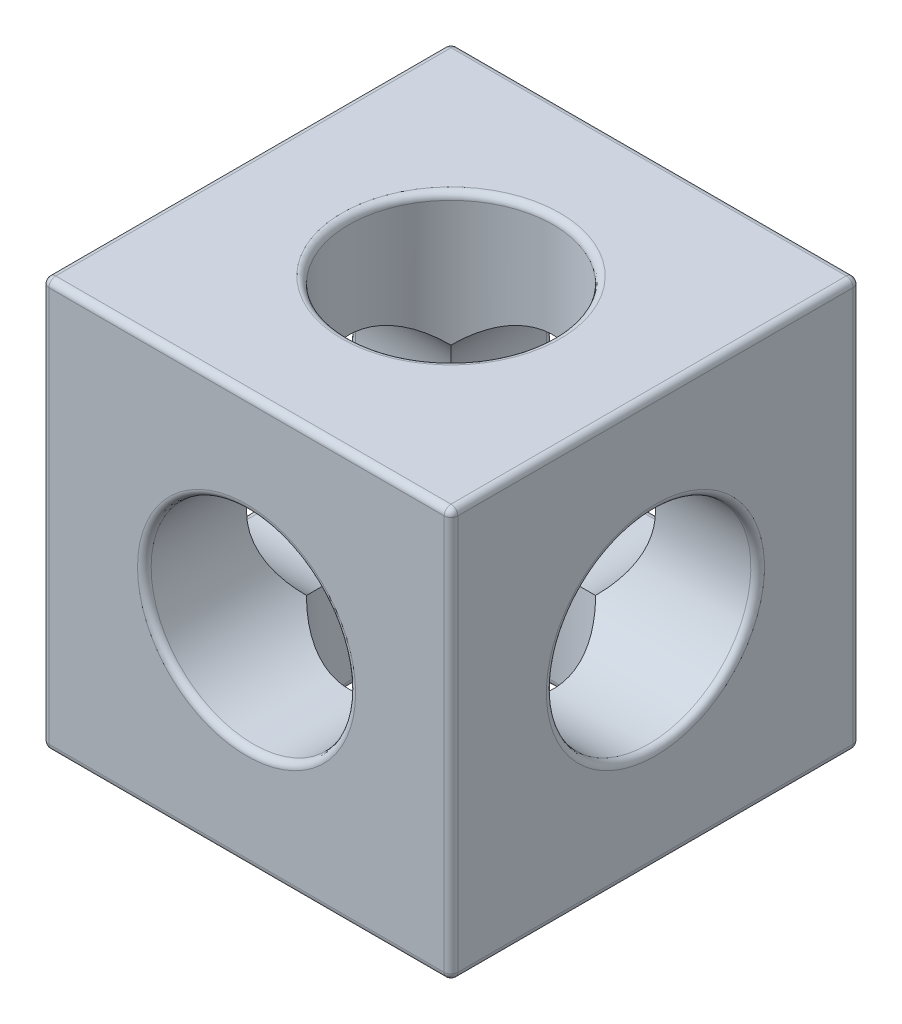
ISO-10303-21;
HEADER;
FILE_DESCRIPTION(('STEP AP214'),'2;1');
FILE_NAME('part.step','',(''),(''),'','','');
FILE_SCHEMA(('AUTOMOTIVE_DESIGN { 1 0 10303 214 1 1 1 1 }'));
ENDSEC;
DATA;
#1=APPLICATION_CONTEXT('core data for automotive mechanical design processes');
#2=APPLICATION_PROTOCOL_DEFINITION('international standard','automotive_design',2000,#1);
#3=PRODUCT_CONTEXT('',#1,'mechanical');
#4=PRODUCT('Part','Part','',(#3));
#5=PRODUCT_RELATED_PRODUCT_CATEGORY('part','',(#4));
#6=PRODUCT_DEFINITION_FORMATION('','',#4);
#7=PRODUCT_DEFINITION_CONTEXT('part definition',#1,'design');
#8=PRODUCT_DEFINITION('design','',#6,#7);
#9=PRODUCT_DEFINITION_SHAPE('','',#8);
#10=(LENGTH_UNIT() NAMED_UNIT(*) SI_UNIT(.MILLI.,.METRE.));
#11=(NAMED_UNIT(*) PLANE_ANGLE_UNIT() SI_UNIT($,.RADIAN.));
#12=(NAMED_UNIT(*) SI_UNIT($,.STERADIAN.) SOLID_ANGLE_UNIT());
#13=UNCERTAINTY_MEASURE_WITH_UNIT(LENGTH_MEASURE(1.E-05),#10,'distance_accuracy_value','');
#14=(GEOMETRIC_REPRESENTATION_CONTEXT(3) GLOBAL_UNCERTAINTY_ASSIGNED_CONTEXT((#13)) GLOBAL_UNIT_ASSIGNED_CONTEXT((#10,
#11,#12)) REPRESENTATION_CONTEXT('',''));
#15=CARTESIAN_POINT('',(0.,0.,0.));
#16=DIRECTION('',(0.,0.,1.));
#17=DIRECTION('',(1.,0.,0.));
#18=AXIS2_PLACEMENT_3D('',#15,#16,#17);
#19=CARTESIAN_POINT('',(38.1,0.,38.1));
#20=DIRECTION('',(0.,1.,0.));
#21=DIRECTION('',(0.,0.,1.));
#22=AXIS2_PLACEMENT_3D('',#19,#20,#21);
#23=CYLINDRICAL_SURFACE('',#22,19.05);
#24=CARTESIAN_POINT('',(38.1,74.93,38.1));
#25=DIRECTION('',(0.,-1.,0.));
#26=DIRECTION('',(0.,0.,-1.));
#27=AXIS2_PLACEMENT_3D('',#24,#25,#26);
#28=CIRCLE('',#27,19.05);
#29=CARTESIAN_POINT('',(38.1,74.93,19.05));
#30=VERTEX_POINT('',#29);
#31=EDGE_CURVE('E11',#30,#30,#28,.F.);
#32=ORIENTED_EDGE('',*,*,#31,.T.);
#33=EDGE_LOOP('',(#32));
#34=FACE_BOUND('',#33,.T.);
#35=CARTESIAN_POINT('',(38.1,38.1,38.1));
#36=DIRECTION('',(-0.707106781186548,0.707106781186547,0.));
#37=DIRECTION('',(0.707106781186547,0.707106781186547,0.));
#38=AXIS2_PLACEMENT_3D('',#35,#36,#37);
#39=ELLIPSE('',#38,26.9407683632075,19.05);
#40=CARTESIAN_POINT('',(51.5703841816037,51.5703841816037,24.6296158183963));
#41=VERTEX_POINT('',#40);
#42=CARTESIAN_POINT('',(51.5703841816037,51.5703841816037,51.5703841816037));
#43=VERTEX_POINT('',#42);
#44=EDGE_CURVE('E167',#41,#43,#39,.F.);
#45=ORIENTED_EDGE('',*,*,#44,.T.);
#46=CARTESIAN_POINT('',(38.1,38.1,38.1));
#47=DIRECTION('',(0.,0.707106781186547,-0.707106781186547));
#48=DIRECTION('',(0.,0.707106781186547,0.707106781186547));
#49=AXIS2_PLACEMENT_3D('',#46,#47,#48);
#50=ELLIPSE('',#49,26.9407683632075,19.05);
#51=CARTESIAN_POINT('',(24.6296158183963,51.5703841816037,51.5703841816037));
#52=VERTEX_POINT('',#51);
#53=EDGE_CURVE('E151',#43,#52,#50,.F.);
#54=ORIENTED_EDGE('',*,*,#53,.T.);
#55=CARTESIAN_POINT('',(38.1,38.1,38.1));
#56=DIRECTION('',(0.707106781186547,0.707106781186547,0.));
#57=DIRECTION('',(-0.707106781186548,0.707106781186547,0.));
#58=AXIS2_PLACEMENT_3D('',#55,#56,#57);
#59=ELLIPSE('',#58,26.9407683632075,19.05);
#60=CARTESIAN_POINT('',(24.6296158183963,51.5703841816037,24.6296158183963));
#61=VERTEX_POINT('',#60);
#62=EDGE_CURVE('E160',#52,#61,#59,.F.);
#63=ORIENTED_EDGE('',*,*,#62,.T.);
#64=CARTESIAN_POINT('',(38.1,38.1,38.1));
#65=DIRECTION('',(0.,0.707106781186547,0.707106781186547));
#66=DIRECTION('',(0.,0.707106781186547,-0.707106781186547));
#67=AXIS2_PLACEMENT_3D('',#64,#65,#66);
#68=ELLIPSE('',#67,26.9407683632075,19.05);
#69=EDGE_CURVE('E342',#61,#41,#68,.F.);
#70=ORIENTED_EDGE('',*,*,#69,.T.);
#71=EDGE_LOOP('',(#45,#54,#63,#70));
#72=FACE_BOUND('',#71,.T.);
#73=ADVANCED_FACE('F35',(#34,#72),#23,.F.);
#74=CARTESIAN_POINT('',(0.,0.,76.2));
#75=DIRECTION('',(1.,0.,0.));
#76=DIRECTION('',(0.,1.,0.));
#77=AXIS2_PLACEMENT_3D('',#74,#75,#76);
#78=PLANE('',#77);
#79=CARTESIAN_POINT('',(0.,38.1,38.1));
#80=DIRECTION('',(1.,0.,0.));
#81=DIRECTION('',(0.,1.,0.));
#82=AXIS2_PLACEMENT_3D('',#79,#80,#81);
#83=CIRCLE('',#82,20.32);
#84=CARTESIAN_POINT('',(0.,58.42,38.1));
#85=VERTEX_POINT('',#84);
#86=EDGE_CURVE('E204',#85,#85,#83,.T.);
#87=ORIENTED_EDGE('',*,*,#86,.T.);
#88=EDGE_LOOP('',(#87));
#89=FACE_BOUND('',#88,.T.);
#90=DIRECTION('',(0.,0.,-1.));
#91=VECTOR('',#90,1.);
#92=CARTESIAN_POINT('',(0.,74.93,76.2));
#93=LINE('',#92,#91);
#94=CARTESIAN_POINT('',(0.,74.93,74.93));
#95=VERTEX_POINT('',#94);
#96=CARTESIAN_POINT('',(0.,74.93,1.26999999999999));
#97=VERTEX_POINT('',#96);
#98=EDGE_CURVE('E195',#95,#97,#93,.T.);
#99=ORIENTED_EDGE('',*,*,#98,.T.);
#100=DIRECTION('',(0.,-1.,0.));
#101=VECTOR('',#100,1.);
#102=CARTESIAN_POINT('',(0.,0.,1.26999999999999));
#103=LINE('',#102,#101);
#104=CARTESIAN_POINT('',(0.,1.27,1.26999999999999));
#105=VERTEX_POINT('',#104);
#106=EDGE_CURVE('E201',#97,#105,#103,.T.);
#107=ORIENTED_EDGE('',*,*,#106,.T.);
#108=DIRECTION('',(0.,0.,-1.));
#109=VECTOR('',#108,1.);
#110=CARTESIAN_POINT('',(0.,1.27,76.2));
#111=LINE('',#110,#109);
#112=CARTESIAN_POINT('',(0.,1.27,74.93));
#113=VERTEX_POINT('',#112);
#114=EDGE_CURVE('E199',#105,#113,#111,.F.);
#115=ORIENTED_EDGE('',*,*,#114,.T.);
#116=DIRECTION('',(0.,-1.,0.));
#117=VECTOR('',#116,1.);
#118=CARTESIAN_POINT('',(0.,0.,74.93));
#119=LINE('',#118,#117);
#120=EDGE_CURVE('E197',#113,#95,#119,.F.);
#121=ORIENTED_EDGE('',*,*,#120,.T.);
#122=EDGE_LOOP('',(#99,#107,#115,#121));
#123=FACE_BOUND('',#122,.T.);
#124=ADVANCED_FACE('F365',(#89,#123),#78,.F.);
#125=CARTESIAN_POINT('',(0.,0.,76.2));
#126=DIRECTION('',(0.,1.,0.));
#127=DIRECTION('',(0.,0.,1.));
#128=AXIS2_PLACEMENT_3D('',#125,#126,#127);
#129=PLANE('',#128);
#130=CARTESIAN_POINT('',(38.1,0.,38.1));
#131=DIRECTION('',(0.,1.,0.));
#132=DIRECTION('',(0.,0.,1.));
#133=AXIS2_PLACEMENT_3D('',#130,#131,#132);
#134=CIRCLE('',#133,20.32);
#135=CARTESIAN_POINT('',(38.1,0.,58.42));
#136=VERTEX_POINT('',#135);
#137=EDGE_CURVE('E219',#136,#136,#134,.T.);
#138=ORIENTED_EDGE('',*,*,#137,.T.);
#139=EDGE_LOOP('',(#138));
#140=FACE_BOUND('',#139,.T.);
#141=DIRECTION('',(1.,0.,0.));
#142=VECTOR('',#141,1.);
#143=CARTESIAN_POINT('',(0.,0.,74.93));
#144=LINE('',#143,#142);
#145=CARTESIAN_POINT('',(74.93,0.,74.93));
#146=VERTEX_POINT('',#145);
#147=CARTESIAN_POINT('',(1.27,0.,74.93));
#148=VERTEX_POINT('',#147);
#149=EDGE_CURVE('E210',#146,#148,#144,.F.);
#150=ORIENTED_EDGE('',*,*,#149,.T.);
#151=DIRECTION('',(0.,0.,-1.));
#152=VECTOR('',#151,1.);
#153=CARTESIAN_POINT('',(1.27,0.,76.2));
#154=LINE('',#153,#152);
#155=CARTESIAN_POINT('',(1.27,0.,1.26999999999999));
#156=VERTEX_POINT('',#155);
#157=EDGE_CURVE('E216',#148,#156,#154,.T.);
#158=ORIENTED_EDGE('',*,*,#157,.T.);
#159=DIRECTION('',(1.,0.,0.));
#160=VECTOR('',#159,1.);
#161=CARTESIAN_POINT('',(76.2,0.,1.26999999999999));
#162=LINE('',#161,#160);
#163=CARTESIAN_POINT('',(74.93,0.,1.26999999999999));
#164=VERTEX_POINT('',#163);
#165=EDGE_CURVE('E214',#156,#164,#162,.T.);
#166=ORIENTED_EDGE('',*,*,#165,.T.);
#167=DIRECTION('',(0.,0.,-1.));
#168=VECTOR('',#167,1.);
#169=CARTESIAN_POINT('',(74.93,0.,76.2));
#170=LINE('',#169,#168);
#171=EDGE_CURVE('E212',#164,#146,#170,.F.);
#172=ORIENTED_EDGE('',*,*,#171,.T.);
#173=EDGE_LOOP('',(#150,#158,#166,#172));
#174=FACE_BOUND('',#173,.T.);
#175=ADVANCED_FACE('F370',(#140,#174),#129,.F.);
#176=CARTESIAN_POINT('',(76.2,0.,76.2));
#177=DIRECTION('',(-1.,0.,0.));
#178=DIRECTION('',(0.,-1.,0.));
#179=AXIS2_PLACEMENT_3D('',#176,#177,#178);
#180=PLANE('',#179);
#181=CARTESIAN_POINT('',(76.2,38.1,38.1));
#182=DIRECTION('',(-1.,0.,0.));
#183=DIRECTION('',(0.,-1.,0.));
#184=AXIS2_PLACEMENT_3D('',#181,#182,#183);
#185=CIRCLE('',#184,20.32);
#186=CARTESIAN_POINT('',(76.2,17.78,38.1));
#187=VERTEX_POINT('',#186);
#188=EDGE_CURVE('E234',#187,#187,#185,.T.);
#189=ORIENTED_EDGE('',*,*,#188,.T.);
#190=EDGE_LOOP('',(#189));
#191=FACE_BOUND('',#190,.T.);
#192=DIRECTION('',(0.,1.,0.));
#193=VECTOR('',#192,1.);
#194=CARTESIAN_POINT('',(76.2,0.,74.93));
#195=LINE('',#194,#193);
#196=CARTESIAN_POINT('',(76.2,74.93,74.93));
#197=VERTEX_POINT('',#196);
#198=CARTESIAN_POINT('',(76.2,1.27,74.93));
#199=VERTEX_POINT('',#198);
#200=EDGE_CURVE('E227',#197,#199,#195,.F.);
#201=ORIENTED_EDGE('',*,*,#200,.T.);
#202=DIRECTION('',(0.,0.,-1.));
#203=VECTOR('',#202,1.);
#204=CARTESIAN_POINT('',(76.2,1.27,76.2));
#205=LINE('',#204,#203);
#206=CARTESIAN_POINT('',(76.2,1.27,1.26999999999999));
#207=VERTEX_POINT('',#206);
#208=EDGE_CURVE('E231',#199,#207,#205,.T.);
#209=ORIENTED_EDGE('',*,*,#208,.T.);
#210=DIRECTION('',(0.,1.,0.));
#211=VECTOR('',#210,1.);
#212=CARTESIAN_POINT('',(76.2,76.2,1.26999999999999));
#213=LINE('',#212,#211);
#214=CARTESIAN_POINT('',(76.2,74.93,1.26999999999999));
#215=VERTEX_POINT('',#214);
#216=EDGE_CURVE('E229',#207,#215,#213,.T.);
#217=ORIENTED_EDGE('',*,*,#216,.T.);
#218=DIRECTION('',(0.,0.,-1.));
#219=VECTOR('',#218,1.);
#220=CARTESIAN_POINT('',(76.2,74.93,76.2));
#221=LINE('',#220,#219);
#222=EDGE_CURVE('E225',#215,#197,#221,.F.);
#223=ORIENTED_EDGE('',*,*,#222,.T.);
#224=EDGE_LOOP('',(#201,#209,#217,#223));
#225=FACE_BOUND('',#224,.T.);
#226=ADVANCED_FACE('F384',(#191,#225),#180,.F.);
#227=CARTESIAN_POINT('',(0.,76.2,76.2));
#228=DIRECTION('',(0.,-1.,0.));
#229=DIRECTION('',(0.,0.,-1.));
#230=AXIS2_PLACEMENT_3D('',#227,#228,#229);
#231=PLANE('',#230);
#232=DIRECTION('',(-1.,0.,0.));
#233=VECTOR('',#232,1.);
#234=CARTESIAN_POINT('',(0.,76.2,74.93));
#235=LINE('',#234,#233);
#236=CARTESIAN_POINT('',(1.26999999999999,76.2,74.93));
#237=VERTEX_POINT('',#236);
#238=CARTESIAN_POINT('',(74.93,76.2,74.93));
#239=VERTEX_POINT('',#238);
#240=EDGE_CURVE('E52',#237,#239,#235,.F.);
#241=ORIENTED_EDGE('',*,*,#240,.T.);
#242=DIRECTION('',(0.,0.,-1.));
#243=VECTOR('',#242,1.);
#244=CARTESIAN_POINT('',(74.93,76.2,76.2));
#245=LINE('',#244,#243);
#246=CARTESIAN_POINT('',(74.93,76.2,1.26999999999999));
#247=VERTEX_POINT('',#246);
#248=EDGE_CURVE('E44',#239,#247,#245,.T.);
#249=ORIENTED_EDGE('',*,*,#248,.T.);
#250=DIRECTION('',(-1.,0.,0.));
#251=VECTOR('',#250,1.);
#252=CARTESIAN_POINT('',(0.,76.2,1.26999999999999));
#253=LINE('',#252,#251);
#254=CARTESIAN_POINT('',(1.26999999999999,76.2,1.26999999999999));
#255=VERTEX_POINT('',#254);
#256=EDGE_CURVE('E258',#247,#255,#253,.T.);
#257=ORIENTED_EDGE('',*,*,#256,.T.);
#258=DIRECTION('',(0.,0.,-1.));
#259=VECTOR('',#258,1.);
#260=CARTESIAN_POINT('',(1.26999999999999,76.2,76.2));
#261=LINE('',#260,#259);
#262=EDGE_CURVE('E57',#255,#237,#261,.F.);
#263=ORIENTED_EDGE('',*,*,#262,.T.);
#264=EDGE_LOOP('',(#241,#249,#257,#263));
#265=FACE_BOUND('',#264,.T.);
#266=CARTESIAN_POINT('',(38.1,76.2,38.1));
#267=DIRECTION('',(0.,-1.,0.));
#268=DIRECTION('',(0.,0.,-1.));
#269=AXIS2_PLACEMENT_3D('',#266,#267,#268);
#270=CIRCLE('',#269,20.32);
#271=CARTESIAN_POINT('',(38.1,76.2,17.78));
#272=VERTEX_POINT('',#271);
#273=EDGE_CURVE('E255',#272,#272,#270,.T.);
#274=ORIENTED_EDGE('',*,*,#273,.T.);
#275=EDGE_LOOP('',(#274));
#276=FACE_BOUND('',#275,.T.);
#277=ADVANCED_FACE('F377',(#265,#276),#231,.F.);
#278=CARTESIAN_POINT('',(0.,0.,76.2));
#279=DIRECTION('',(0.,0.,-1.));
#280=DIRECTION('',(-1.,0.,0.));
#281=AXIS2_PLACEMENT_3D('',#278,#279,#280);
#282=PLANE('',#281);
#283=CARTESIAN_POINT('',(38.1,38.1,76.2));
#284=DIRECTION('',(0.,0.,-1.));
#285=DIRECTION('',(-1.,0.,0.));
#286=AXIS2_PLACEMENT_3D('',#283,#284,#285);
#287=CIRCLE('',#286,20.32);
#288=CARTESIAN_POINT('',(17.78,38.1,76.2));
#289=VERTEX_POINT('',#288);
#290=EDGE_CURVE('E249',#289,#289,#287,.T.);
#291=ORIENTED_EDGE('',*,*,#290,.T.);
#292=EDGE_LOOP('',(#291));
#293=FACE_BOUND('',#292,.T.);
#294=DIRECTION('',(1.,0.,0.));
#295=VECTOR('',#294,1.);
#296=CARTESIAN_POINT('',(0.,1.27,76.2));
#297=LINE('',#296,#295);
#298=CARTESIAN_POINT('',(1.27,1.27,76.2));
#299=VERTEX_POINT('',#298);
#300=CARTESIAN_POINT('',(74.93,1.27,76.2));
#301=VERTEX_POINT('',#300);
#302=EDGE_CURVE('E244',#299,#301,#297,.T.);
#303=ORIENTED_EDGE('',*,*,#302,.T.);
#304=DIRECTION('',(0.,1.,0.));
#305=VECTOR('',#304,1.);
#306=CARTESIAN_POINT('',(74.93,0.,76.2));
#307=LINE('',#306,#305);
#308=CARTESIAN_POINT('',(74.93,74.93,76.2));
#309=VERTEX_POINT('',#308);
#310=EDGE_CURVE('E246',#301,#309,#307,.T.);
#311=ORIENTED_EDGE('',*,*,#310,.T.);
#312=DIRECTION('',(-1.,0.,0.));
#313=VECTOR('',#312,1.);
#314=CARTESIAN_POINT('',(0.,74.93,76.2));
#315=LINE('',#314,#313);
#316=CARTESIAN_POINT('',(1.26999999999999,74.93,76.2));
#317=VERTEX_POINT('',#316);
#318=EDGE_CURVE('E240',#309,#317,#315,.T.);
#319=ORIENTED_EDGE('',*,*,#318,.T.);
#320=DIRECTION('',(0.,-1.,0.));
#321=VECTOR('',#320,1.);
#322=CARTESIAN_POINT('',(1.27,0.,76.2));
#323=LINE('',#322,#321);
#324=EDGE_CURVE('E242',#317,#299,#323,.T.);
#325=ORIENTED_EDGE('',*,*,#324,.T.);
#326=EDGE_LOOP('',(#303,#311,#319,#325));
#327=FACE_BOUND('',#326,.T.);
#328=ADVANCED_FACE('F374',(#293,#327),#282,.F.);
#329=CARTESIAN_POINT('',(0.,0.,0.));
#330=DIRECTION('',(0.,0.,-1.));
#331=DIRECTION('',(-1.,0.,0.));
#332=AXIS2_PLACEMENT_3D('',#329,#330,#331);
#333=PLANE('',#332);
#334=CARTESIAN_POINT('',(38.1,38.1,0.));
#335=DIRECTION('',(0.,0.,-1.));
#336=DIRECTION('',(-1.,0.,0.));
#337=AXIS2_PLACEMENT_3D('',#334,#335,#336);
#338=CIRCLE('',#337,20.32);
#339=CARTESIAN_POINT('',(17.78,38.1,0.));
#340=VERTEX_POINT('',#339);
#341=EDGE_CURVE('E192',#340,#340,#338,.F.);
#342=ORIENTED_EDGE('',*,*,#341,.T.);
#343=EDGE_LOOP('',(#342));
#344=FACE_BOUND('',#343,.T.);
#345=DIRECTION('',(1.,0.,0.));
#346=VECTOR('',#345,1.);
#347=CARTESIAN_POINT('',(0.,1.27,0.));
#348=LINE('',#347,#346);
#349=CARTESIAN_POINT('',(74.93,1.27,0.));
#350=VERTEX_POINT('',#349);
#351=CARTESIAN_POINT('',(1.27,1.27,0.));
#352=VERTEX_POINT('',#351);
#353=EDGE_CURVE('E187',#350,#352,#348,.F.);
#354=ORIENTED_EDGE('',*,*,#353,.T.);
#355=DIRECTION('',(0.,-1.,0.));
#356=VECTOR('',#355,1.);
#357=CARTESIAN_POINT('',(1.26999999999999,76.2,0.));
#358=LINE('',#357,#356);
#359=CARTESIAN_POINT('',(1.26999999999999,74.93,0.));
#360=VERTEX_POINT('',#359);
#361=EDGE_CURVE('E189',#352,#360,#358,.F.);
#362=ORIENTED_EDGE('',*,*,#361,.T.);
#363=DIRECTION('',(-1.,0.,0.));
#364=VECTOR('',#363,1.);
#365=CARTESIAN_POINT('',(76.2,74.93,0.));
#366=LINE('',#365,#364);
#367=CARTESIAN_POINT('',(74.93,74.93,0.));
#368=VERTEX_POINT('',#367);
#369=EDGE_CURVE('E183',#360,#368,#366,.F.);
#370=ORIENTED_EDGE('',*,*,#369,.T.);
#371=DIRECTION('',(0.,1.,0.));
#372=VECTOR('',#371,1.);
#373=CARTESIAN_POINT('',(74.93,0.,0.));
#374=LINE('',#373,#372);
#375=EDGE_CURVE('E185',#368,#350,#374,.F.);
#376=ORIENTED_EDGE('',*,*,#375,.T.);
#377=EDGE_LOOP('',(#354,#362,#370,#376));
#378=FACE_BOUND('',#377,.T.);
#379=ADVANCED_FACE('F360',(#344,#378),#333,.T.);
#380=CARTESIAN_POINT('',(38.1,1.27,38.1));
#381=DIRECTION('',(0.,1.,0.));
#382=DIRECTION('',(0.,0.,1.));
#383=AXIS2_PLACEMENT_3D('',#380,#381,#382);
#384=CIRCLE('',#383,19.05);
#385=CARTESIAN_POINT('',(38.1,1.27,57.15));
#386=VERTEX_POINT('',#385);
#387=EDGE_CURVE('E222',#386,#386,#384,.F.);
#388=ORIENTED_EDGE('',*,*,#387,.T.);
#389=EDGE_LOOP('',(#388));
#390=FACE_BOUND('',#389,.T.);
#391=CARTESIAN_POINT('',(38.1,38.1,38.1));
#392=DIRECTION('',(0.707106781186547,0.707106781186547,0.));
#393=DIRECTION('',(-0.707106781186548,0.707106781186547,0.));
#394=AXIS2_PLACEMENT_3D('',#391,#392,#393);
#395=ELLIPSE('',#394,26.9407683632075,19.05);
#396=CARTESIAN_POINT('',(51.5703841816037,24.6296158183963,51.5703841816037));
#397=VERTEX_POINT('',#396);
#398=CARTESIAN_POINT('',(51.5703841816037,24.6296158183963,24.6296158183963));
#399=VERTEX_POINT('',#398);
#400=EDGE_CURVE('E172',#397,#399,#395,.T.);
#401=ORIENTED_EDGE('',*,*,#400,.T.);
#402=CARTESIAN_POINT('',(38.1,38.1,38.1));
#403=DIRECTION('',(0.,0.707106781186547,-0.707106781186547));
#404=DIRECTION('',(0.,0.707106781186547,0.707106781186547));
#405=AXIS2_PLACEMENT_3D('',#402,#403,#404);
#406=ELLIPSE('',#405,26.9407683632075,19.05);
#407=CARTESIAN_POINT('',(24.6296158183963,24.6296158183963,24.6296158183963));
#408=VERTEX_POINT('',#407);
#409=EDGE_CURVE('E339',#399,#408,#406,.T.);
#410=ORIENTED_EDGE('',*,*,#409,.T.);
#411=CARTESIAN_POINT('',(38.1,38.1,38.1));
#412=DIRECTION('',(-0.707106781186548,0.707106781186547,0.));
#413=DIRECTION('',(0.707106781186547,0.707106781186547,0.));
#414=AXIS2_PLACEMENT_3D('',#411,#412,#413);
#415=ELLIPSE('',#414,26.9407683632075,19.05);
#416=CARTESIAN_POINT('',(24.6296158183963,24.6296158183963,51.5703841816037));
#417=VERTEX_POINT('',#416);
#418=EDGE_CURVE('E175',#408,#417,#415,.T.);
#419=ORIENTED_EDGE('',*,*,#418,.T.);
#420=CARTESIAN_POINT('',(38.1,38.1,38.1));
#421=DIRECTION('',(0.,0.707106781186547,0.707106781186547));
#422=DIRECTION('',(0.,0.707106781186547,-0.707106781186547));
#423=AXIS2_PLACEMENT_3D('',#420,#421,#422);
#424=ELLIPSE('',#423,26.9407683632075,19.05);
#425=EDGE_CURVE('E154',#417,#397,#424,.T.);
#426=ORIENTED_EDGE('',*,*,#425,.T.);
#427=EDGE_LOOP('',(#401,#410,#419,#426));
#428=FACE_BOUND('',#427,.T.);
#429=ADVANCED_FACE('F347',(#390,#428),#23,.F.);
#430=CARTESIAN_POINT('',(0.,38.1,38.1));
#431=DIRECTION('',(1.,0.,0.));
#432=DIRECTION('',(0.,1.,0.));
#433=AXIS2_PLACEMENT_3D('',#430,#431,#432);
#434=CYLINDRICAL_SURFACE('',#433,19.05);
#435=CARTESIAN_POINT('',(74.93,38.1,38.1));
#436=DIRECTION('',(-1.,0.,0.));
#437=DIRECTION('',(0.,-1.,0.));
#438=AXIS2_PLACEMENT_3D('',#435,#436,#437);
#439=CIRCLE('',#438,19.05);
#440=CARTESIAN_POINT('',(74.93,19.05,38.1));
#441=VERTEX_POINT('',#440);
#442=EDGE_CURVE('E237',#441,#441,#439,.F.);
#443=ORIENTED_EDGE('',*,*,#442,.T.);
#444=EDGE_LOOP('',(#443));
#445=FACE_BOUND('',#444,.T.);
#446=ORIENTED_EDGE('',*,*,#400,.F.);
#447=CARTESIAN_POINT('',(38.1,38.1,38.1));
#448=DIRECTION('',(0.707106781186548,0.,-0.707106781186547));
#449=DIRECTION('',(0.707106781186548,0.,0.707106781186547));
#450=AXIS2_PLACEMENT_3D('',#447,#448,#449);
#451=ELLIPSE('',#450,26.9407683632075,19.05);
#452=EDGE_CURVE('E168',#397,#43,#451,.F.);
#453=ORIENTED_EDGE('',*,*,#452,.T.);
#454=ORIENTED_EDGE('',*,*,#44,.F.);
#455=CARTESIAN_POINT('',(38.1,38.1,38.1));
#456=DIRECTION('',(0.707106781186548,0.,0.707106781186547));
#457=DIRECTION('',(0.707106781186548,0.,-0.707106781186547));
#458=AXIS2_PLACEMENT_3D('',#455,#456,#457);
#459=ELLIPSE('',#458,26.9407683632075,19.05);
#460=EDGE_CURVE('E344',#41,#399,#459,.F.);
#461=ORIENTED_EDGE('',*,*,#460,.T.);
#462=EDGE_LOOP('',(#446,#453,#454,#461));
#463=FACE_BOUND('',#462,.T.);
#464=ADVANCED_FACE('F351',(#445,#463),#434,.F.);
#465=CARTESIAN_POINT('',(1.26999999999999,38.1,38.1));
#466=DIRECTION('',(1.,0.,0.));
#467=DIRECTION('',(0.,1.,0.));
#468=AXIS2_PLACEMENT_3D('',#465,#466,#467);
#469=CIRCLE('',#468,19.05);
#470=CARTESIAN_POINT('',(1.26999999999999,57.15,38.1));
#471=VERTEX_POINT('',#470);
#472=EDGE_CURVE('E207',#471,#471,#469,.F.);
#473=ORIENTED_EDGE('',*,*,#472,.T.);
#474=EDGE_LOOP('',(#473));
#475=FACE_BOUND('',#474,.T.);
#476=ORIENTED_EDGE('',*,*,#418,.F.);
#477=CARTESIAN_POINT('',(38.1,38.1,38.1));
#478=DIRECTION('',(0.707106781186548,0.,-0.707106781186547));
#479=DIRECTION('',(0.707106781186548,0.,0.707106781186547));
#480=AXIS2_PLACEMENT_3D('',#477,#478,#479);
#481=ELLIPSE('',#480,26.9407683632075,19.05);
#482=EDGE_CURVE('E159',#408,#61,#481,.T.);
#483=ORIENTED_EDGE('',*,*,#482,.T.);
#484=ORIENTED_EDGE('',*,*,#62,.F.);
#485=CARTESIAN_POINT('',(38.1,38.1,38.1));
#486=DIRECTION('',(0.707106781186548,0.,0.707106781186547));
#487=DIRECTION('',(0.707106781186548,0.,-0.707106781186547));
#488=AXIS2_PLACEMENT_3D('',#485,#486,#487);
#489=ELLIPSE('',#488,26.9407683632075,19.05);
#490=EDGE_CURVE('E148',#52,#417,#489,.T.);
#491=ORIENTED_EDGE('',*,*,#490,.T.);
#492=EDGE_LOOP('',(#476,#483,#484,#491));
#493=FACE_BOUND('',#492,.T.);
#494=ADVANCED_FACE('F171',(#475,#493),#434,.F.);
#495=CARTESIAN_POINT('',(38.1,38.1,76.2));
#496=DIRECTION('',(0.,0.,-1.));
#497=DIRECTION('',(-1.,0.,0.));
#498=AXIS2_PLACEMENT_3D('',#495,#496,#497);
#499=CYLINDRICAL_SURFACE('',#498,19.05);
#500=CARTESIAN_POINT('',(38.1,38.1,74.93));
#501=DIRECTION('',(0.,0.,-1.));
#502=DIRECTION('',(-1.,0.,0.));
#503=AXIS2_PLACEMENT_3D('',#500,#501,#502);
#504=CIRCLE('',#503,19.05);
#505=CARTESIAN_POINT('',(19.05,38.1,74.93));
#506=VERTEX_POINT('',#505);
#507=EDGE_CURVE('E252',#506,#506,#504,.F.);
#508=ORIENTED_EDGE('',*,*,#507,.T.);
#509=EDGE_LOOP('',(#508));
#510=FACE_BOUND('',#509,.T.);
#511=ORIENTED_EDGE('',*,*,#425,.F.);
#512=ORIENTED_EDGE('',*,*,#490,.F.);
#513=ORIENTED_EDGE('',*,*,#53,.F.);
#514=ORIENTED_EDGE('',*,*,#452,.F.);
#515=EDGE_LOOP('',(#511,#512,#513,#514));
#516=FACE_BOUND('',#515,.T.);
#517=ADVANCED_FACE('F150',(#510,#516),#499,.F.);
#518=CARTESIAN_POINT('',(38.1,38.1,1.26999999999999));
#519=DIRECTION('',(0.,0.,-1.));
#520=DIRECTION('',(-1.,0.,0.));
#521=AXIS2_PLACEMENT_3D('',#518,#519,#520);
#522=CIRCLE('',#521,19.05);
#523=CARTESIAN_POINT('',(19.05,38.1,1.26999999999999));
#524=VERTEX_POINT('',#523);
#525=EDGE_CURVE('E180',#524,#524,#522,.T.);
#526=ORIENTED_EDGE('',*,*,#525,.T.);
#527=EDGE_LOOP('',(#526));
#528=FACE_BOUND('',#527,.T.);
#529=ORIENTED_EDGE('',*,*,#69,.F.);
#530=ORIENTED_EDGE('',*,*,#482,.F.);
#531=ORIENTED_EDGE('',*,*,#409,.F.);
#532=ORIENTED_EDGE('',*,*,#460,.F.);
#533=EDGE_LOOP('',(#529,#530,#531,#532));
#534=FACE_BOUND('',#533,.T.);
#535=ADVANCED_FACE('F349',(#528,#534),#499,.F.);
#536=CARTESIAN_POINT('',(38.1,38.1,1.26999999999999));
#537=DIRECTION('',(0.,0.,-1.));
#538=DIRECTION('',(-1.,0.,0.));
#539=AXIS2_PLACEMENT_3D('',#536,#537,#538);
#540=TOROIDAL_SURFACE('',#539,20.32,1.27);
#541=ORIENTED_EDGE('',*,*,#341,.F.);
#542=EDGE_LOOP('',(#541));
#543=FACE_BOUND('',#542,.T.);
#544=ORIENTED_EDGE('',*,*,#525,.F.);
#545=EDGE_LOOP('',(#544));
#546=FACE_BOUND('',#545,.T.);
#547=ADVANCED_FACE('F391',(#543,#546),#540,.T.);
#548=CARTESIAN_POINT('',(74.93,0.,74.93));
#549=DIRECTION('',(0.,1.,0.));
#550=DIRECTION('',(-1.,0.,0.));
#551=AXIS2_PLACEMENT_3D('',#548,#549,#550);
#552=CYLINDRICAL_SURFACE('',#551,1.27);
#553=CARTESIAN_POINT('',(74.93,74.93,74.93));
#554=DIRECTION('',(0.,1.,0.));
#555=DIRECTION('',(0.,0.,1.));
#556=AXIS2_PLACEMENT_3D('',#553,#554,#555);
#557=CIRCLE('',#556,1.27);
#558=EDGE_CURVE('E39',#309,#197,#557,.T.);
#559=ORIENTED_EDGE('',*,*,#558,.F.);
#560=ORIENTED_EDGE('',*,*,#310,.F.);
#561=CARTESIAN_POINT('',(74.93,1.27,74.93));
#562=DIRECTION('',(0.,-1.,0.));
#563=DIRECTION('',(1.,0.,0.));
#564=AXIS2_PLACEMENT_3D('',#561,#562,#563);
#565=CIRCLE('',#564,1.27);
#566=EDGE_CURVE('E323',#199,#301,#565,.T.);
#567=ORIENTED_EDGE('',*,*,#566,.F.);
#568=ORIENTED_EDGE('',*,*,#200,.F.);
#569=EDGE_LOOP('',(#559,#560,#567,#568));
#570=FACE_BOUND('',#569,.T.);
#571=ADVANCED_FACE('F394',(#570),#552,.T.);
#572=CARTESIAN_POINT('',(74.93,74.93,74.93));
#573=DIRECTION('',(0.,0.,1.));
#574=DIRECTION('',(1.,0.,0.));
#575=AXIS2_PLACEMENT_3D('',#572,#573,#574);
#576=SPHERICAL_SURFACE('',#575,1.27);
#577=CARTESIAN_POINT('',(74.93,74.93,74.93));
#578=DIRECTION('',(1.,0.,0.));
#579=DIRECTION('',(0.,0.,-1.));
#580=AXIS2_PLACEMENT_3D('',#577,#578,#579);
#581=CIRCLE('',#580,1.27);
#582=EDGE_CURVE('E319',#309,#239,#581,.F.);
#583=ORIENTED_EDGE('',*,*,#582,.F.);
#584=ORIENTED_EDGE('',*,*,#558,.T.);
#585=CARTESIAN_POINT('',(74.93,74.93,74.93));
#586=DIRECTION('',(0.,0.,1.));
#587=DIRECTION('',(1.,0.,0.));
#588=AXIS2_PLACEMENT_3D('',#585,#586,#587);
#589=CIRCLE('',#588,1.27);
#590=EDGE_CURVE('E321',#239,#197,#589,.F.);
#591=ORIENTED_EDGE('',*,*,#590,.F.);
#592=EDGE_LOOP('',(#583,#584,#591));
#593=FACE_BOUND('',#592,.T.);
#594=ADVANCED_FACE('F468',(#593),#576,.T.);
#595=CARTESIAN_POINT('',(74.93,1.27,74.93));
#596=DIRECTION('',(0.,0.,1.));
#597=DIRECTION('',(1.,0.,0.));
#598=AXIS2_PLACEMENT_3D('',#595,#596,#597);
#599=SPHERICAL_SURFACE('',#598,1.27);
#600=CARTESIAN_POINT('',(74.93,1.27,74.93));
#601=DIRECTION('',(0.,0.,1.));
#602=DIRECTION('',(1.,0.,0.));
#603=AXIS2_PLACEMENT_3D('',#600,#601,#602);
#604=CIRCLE('',#603,1.27);
#605=EDGE_CURVE('E313',#199,#146,#604,.F.);
#606=ORIENTED_EDGE('',*,*,#605,.F.);
#607=ORIENTED_EDGE('',*,*,#566,.T.);
#608=CARTESIAN_POINT('',(74.93,1.27,74.93));
#609=DIRECTION('',(1.,0.,0.));
#610=DIRECTION('',(0.,0.,-1.));
#611=AXIS2_PLACEMENT_3D('',#608,#609,#610);
#612=CIRCLE('',#611,1.27);
#613=EDGE_CURVE('E316',#146,#301,#612,.F.);
#614=ORIENTED_EDGE('',*,*,#613,.F.);
#615=EDGE_LOOP('',(#606,#607,#614));
#616=FACE_BOUND('',#615,.T.);
#617=ADVANCED_FACE('F464',(#616),#599,.T.);
#618=CARTESIAN_POINT('',(74.93,74.93,76.2));
#619=DIRECTION('',(0.,0.,-1.));
#620=DIRECTION('',(-1.,0.,0.));
#621=AXIS2_PLACEMENT_3D('',#618,#619,#620);
#622=CYLINDRICAL_SURFACE('',#621,1.27);
#623=ORIENTED_EDGE('',*,*,#590,.T.);
#624=ORIENTED_EDGE('',*,*,#222,.F.);
#625=CARTESIAN_POINT('',(74.93,74.93,1.26999999999999));
#626=DIRECTION('',(0.,0.,-1.));
#627=DIRECTION('',(-1.,0.,0.));
#628=AXIS2_PLACEMENT_3D('',#625,#626,#627);
#629=CIRCLE('',#628,1.27);
#630=EDGE_CURVE('E307',#247,#215,#629,.T.);
#631=ORIENTED_EDGE('',*,*,#630,.F.);
#632=ORIENTED_EDGE('',*,*,#248,.F.);
#633=EDGE_LOOP('',(#623,#624,#631,#632));
#634=FACE_BOUND('',#633,.T.);
#635=ADVANCED_FACE('F460',(#634),#622,.T.);
#636=CARTESIAN_POINT('',(0.,74.93,74.93));
#637=DIRECTION('',(-1.,0.,0.));
#638=DIRECTION('',(0.,0.,1.));
#639=AXIS2_PLACEMENT_3D('',#636,#637,#638);
#640=CYLINDRICAL_SURFACE('',#639,1.27);
#641=ORIENTED_EDGE('',*,*,#582,.T.);
#642=ORIENTED_EDGE('',*,*,#240,.F.);
#643=CARTESIAN_POINT('',(1.26999999999999,74.93,74.93));
#644=DIRECTION('',(-1.,0.,0.));
#645=DIRECTION('',(0.,0.,1.));
#646=AXIS2_PLACEMENT_3D('',#643,#644,#645);
#647=CIRCLE('',#646,1.27);
#648=EDGE_CURVE('E304',#317,#237,#647,.T.);
#649=ORIENTED_EDGE('',*,*,#648,.F.);
#650=ORIENTED_EDGE('',*,*,#318,.F.);
#651=EDGE_LOOP('',(#641,#642,#649,#650));
#652=FACE_BOUND('',#651,.T.);
#653=ADVANCED_FACE('F456',(#652),#640,.T.);
#654=CARTESIAN_POINT('',(1.27,0.,74.93));
#655=DIRECTION('',(0.,-1.,0.));
#656=DIRECTION('',(1.,0.,0.));
#657=AXIS2_PLACEMENT_3D('',#654,#655,#656);
#658=CYLINDRICAL_SURFACE('',#657,1.27);
#659=CARTESIAN_POINT('',(1.27,1.27,74.93));
#660=DIRECTION('',(0.,-1.,0.));
#661=DIRECTION('',(1.,0.,0.));
#662=AXIS2_PLACEMENT_3D('',#659,#660,#661);
#663=CIRCLE('',#662,1.27);
#664=EDGE_CURVE('E298',#299,#113,#663,.T.);
#665=ORIENTED_EDGE('',*,*,#664,.F.);
#666=ORIENTED_EDGE('',*,*,#324,.F.);
#667=CARTESIAN_POINT('',(1.26999999999999,74.93,74.93));
#668=DIRECTION('',(0.,1.,0.));
#669=DIRECTION('',(0.,0.,1.));
#670=AXIS2_PLACEMENT_3D('',#667,#668,#669);
#671=CIRCLE('',#670,1.27);
#672=EDGE_CURVE('E301',#95,#317,#671,.T.);
#673=ORIENTED_EDGE('',*,*,#672,.F.);
#674=ORIENTED_EDGE('',*,*,#120,.F.);
#675=EDGE_LOOP('',(#665,#666,#673,#674));
#676=FACE_BOUND('',#675,.T.);
#677=ADVANCED_FACE('F452',(#676),#658,.T.);
#678=CARTESIAN_POINT('',(0.,1.27,74.93));
#679=DIRECTION('',(1.,0.,0.));
#680=DIRECTION('',(0.,0.,-1.));
#681=AXIS2_PLACEMENT_3D('',#678,#679,#680);
#682=CYLINDRICAL_SURFACE('',#681,1.27);
#683=ORIENTED_EDGE('',*,*,#613,.T.);
#684=ORIENTED_EDGE('',*,*,#302,.F.);
#685=CARTESIAN_POINT('',(1.27,1.27,74.93));
#686=DIRECTION('',(-1.,0.,0.));
#687=DIRECTION('',(0.,0.,1.));
#688=AXIS2_PLACEMENT_3D('',#685,#686,#687);
#689=CIRCLE('',#688,1.27);
#690=EDGE_CURVE('E295',#148,#299,#689,.T.);
#691=ORIENTED_EDGE('',*,*,#690,.F.);
#692=ORIENTED_EDGE('',*,*,#149,.F.);
#693=EDGE_LOOP('',(#683,#684,#691,#692));
#694=FACE_BOUND('',#693,.T.);
#695=ADVANCED_FACE('F448',(#694),#682,.T.);
#696=CARTESIAN_POINT('',(74.93,1.27,76.2));
#697=DIRECTION('',(0.,0.,-1.));
#698=DIRECTION('',(-1.,0.,0.));
#699=AXIS2_PLACEMENT_3D('',#696,#697,#698);
#700=CYLINDRICAL_SURFACE('',#699,1.27);
#701=ORIENTED_EDGE('',*,*,#605,.T.);
#702=ORIENTED_EDGE('',*,*,#171,.F.);
#703=CARTESIAN_POINT('',(74.93,1.27,1.26999999999999));
#704=DIRECTION('',(0.,0.,-1.));
#705=DIRECTION('',(-1.,0.,0.));
#706=AXIS2_PLACEMENT_3D('',#703,#704,#705);
#707=CIRCLE('',#706,1.27);
#708=EDGE_CURVE('E292',#207,#164,#707,.T.);
#709=ORIENTED_EDGE('',*,*,#708,.F.);
#710=ORIENTED_EDGE('',*,*,#208,.F.);
#711=EDGE_LOOP('',(#701,#702,#709,#710));
#712=FACE_BOUND('',#711,.T.);
#713=ADVANCED_FACE('F444',(#712),#700,.T.);
#714=CARTESIAN_POINT('',(74.93,0.,1.26999999999999));
#715=DIRECTION('',(0.,-1.,0.));
#716=DIRECTION('',(1.,0.,0.));
#717=AXIS2_PLACEMENT_3D('',#714,#715,#716);
#718=CYLINDRICAL_SURFACE('',#717,1.27);
#719=CARTESIAN_POINT('',(74.93,74.93,1.26999999999999));
#720=DIRECTION('',(0.,1.,0.));
#721=DIRECTION('',(0.,0.,1.));
#722=AXIS2_PLACEMENT_3D('',#719,#720,#721);
#723=CIRCLE('',#722,1.27);
#724=EDGE_CURVE('E310',#215,#368,#723,.T.);
#725=ORIENTED_EDGE('',*,*,#724,.F.);
#726=ORIENTED_EDGE('',*,*,#216,.F.);
#727=CARTESIAN_POINT('',(74.93,1.27,1.27));
#728=DIRECTION('',(0.,-1.,0.));
#729=DIRECTION('',(1.,0.,0.));
#730=AXIS2_PLACEMENT_3D('',#727,#728,#729);
#731=CIRCLE('',#730,1.27);
#732=EDGE_CURVE('E290',#350,#207,#731,.T.);
#733=ORIENTED_EDGE('',*,*,#732,.F.);
#734=ORIENTED_EDGE('',*,*,#375,.F.);
#735=EDGE_LOOP('',(#725,#726,#733,#734));
#736=FACE_BOUND('',#735,.T.);
#737=ADVANCED_FACE('F440',(#736),#718,.T.);
#738=CARTESIAN_POINT('',(74.93,74.93,1.27));
#739=DIRECTION('',(0.,0.,1.));
#740=DIRECTION('',(1.,0.,0.));
#741=AXIS2_PLACEMENT_3D('',#738,#739,#740);
#742=SPHERICAL_SURFACE('',#741,1.27);
#743=ORIENTED_EDGE('',*,*,#630,.T.);
#744=ORIENTED_EDGE('',*,*,#724,.T.);
#745=CARTESIAN_POINT('',(74.93,74.93,1.27));
#746=DIRECTION('',(1.,0.,0.));
#747=DIRECTION('',(0.,0.,-1.));
#748=AXIS2_PLACEMENT_3D('',#745,#746,#747);
#749=CIRCLE('',#748,1.27);
#750=EDGE_CURVE('E287',#247,#368,#749,.F.);
#751=ORIENTED_EDGE('',*,*,#750,.F.);
#752=EDGE_LOOP('',(#743,#744,#751));
#753=FACE_BOUND('',#752,.T.);
#754=ADVANCED_FACE('F436',(#753),#742,.T.);
#755=CARTESIAN_POINT('',(1.26999999999999,74.93,74.93));
#756=DIRECTION('',(0.,0.,1.));
#757=DIRECTION('',(1.,0.,0.));
#758=AXIS2_PLACEMENT_3D('',#755,#756,#757);
#759=SPHERICAL_SURFACE('',#758,1.27);
#760=ORIENTED_EDGE('',*,*,#672,.T.);
#761=ORIENTED_EDGE('',*,*,#648,.T.);
#762=CARTESIAN_POINT('',(1.26999999999999,74.93,74.93));
#763=DIRECTION('',(0.,0.,1.));
#764=DIRECTION('',(1.,0.,0.));
#765=AXIS2_PLACEMENT_3D('',#762,#763,#764);
#766=CIRCLE('',#765,1.27);
#767=EDGE_CURVE('E284',#95,#237,#766,.F.);
#768=ORIENTED_EDGE('',*,*,#767,.F.);
#769=EDGE_LOOP('',(#760,#761,#768));
#770=FACE_BOUND('',#769,.T.);
#771=ADVANCED_FACE('F432',(#770),#759,.T.);
#772=CARTESIAN_POINT('',(1.27,1.27,74.93));
#773=DIRECTION('',(0.,0.,1.));
#774=DIRECTION('',(1.,0.,0.));
#775=AXIS2_PLACEMENT_3D('',#772,#773,#774);
#776=SPHERICAL_SURFACE('',#775,1.27);
#777=ORIENTED_EDGE('',*,*,#690,.T.);
#778=ORIENTED_EDGE('',*,*,#664,.T.);
#779=CARTESIAN_POINT('',(1.27,1.27,74.93));
#780=DIRECTION('',(0.,0.,1.));
#781=DIRECTION('',(1.,0.,0.));
#782=AXIS2_PLACEMENT_3D('',#779,#780,#781);
#783=CIRCLE('',#782,1.27);
#784=EDGE_CURVE('E281',#148,#113,#783,.F.);
#785=ORIENTED_EDGE('',*,*,#784,.F.);
#786=EDGE_LOOP('',(#777,#778,#785));
#787=FACE_BOUND('',#786,.T.);
#788=ADVANCED_FACE('F428',(#787),#776,.T.);
#789=CARTESIAN_POINT('',(74.93,1.27,1.27));
#790=DIRECTION('',(0.,0.,1.));
#791=DIRECTION('',(1.,0.,0.));
#792=AXIS2_PLACEMENT_3D('',#789,#790,#791);
#793=SPHERICAL_SURFACE('',#792,1.27);
#794=ORIENTED_EDGE('',*,*,#732,.T.);
#795=ORIENTED_EDGE('',*,*,#708,.T.);
#796=CARTESIAN_POINT('',(74.93,1.27,1.26999999999999));
#797=DIRECTION('',(1.,0.,0.));
#798=DIRECTION('',(0.,0.,-1.));
#799=AXIS2_PLACEMENT_3D('',#796,#797,#798);
#800=CIRCLE('',#799,1.27);
#801=EDGE_CURVE('E278',#350,#164,#800,.F.);
#802=ORIENTED_EDGE('',*,*,#801,.F.);
#803=EDGE_LOOP('',(#794,#795,#802));
#804=FACE_BOUND('',#803,.T.);
#805=ADVANCED_FACE('F424',(#804),#793,.T.);
#806=CARTESIAN_POINT('',(0.,74.93,1.26999999999999));
#807=DIRECTION('',(1.,0.,0.));
#808=DIRECTION('',(0.,0.,-1.));
#809=AXIS2_PLACEMENT_3D('',#806,#807,#808);
#810=CYLINDRICAL_SURFACE('',#809,1.27);
#811=ORIENTED_EDGE('',*,*,#750,.T.);
#812=ORIENTED_EDGE('',*,*,#369,.F.);
#813=CARTESIAN_POINT('',(1.26999999999999,74.93,1.26999999999999));
#814=DIRECTION('',(-1.,0.,0.));
#815=DIRECTION('',(0.,0.,1.));
#816=AXIS2_PLACEMENT_3D('',#813,#814,#815);
#817=CIRCLE('',#816,1.27);
#818=EDGE_CURVE('E275',#255,#360,#817,.T.);
#819=ORIENTED_EDGE('',*,*,#818,.F.);
#820=ORIENTED_EDGE('',*,*,#256,.F.);
#821=EDGE_LOOP('',(#811,#812,#819,#820));
#822=FACE_BOUND('',#821,.T.);
#823=ADVANCED_FACE('F420',(#822),#810,.T.);
#824=CARTESIAN_POINT('',(1.26999999999999,74.93,76.2));
#825=DIRECTION('',(0.,0.,-1.));
#826=DIRECTION('',(-1.,0.,0.));
#827=AXIS2_PLACEMENT_3D('',#824,#825,#826);
#828=CYLINDRICAL_SURFACE('',#827,1.27);
#829=ORIENTED_EDGE('',*,*,#767,.T.);
#830=ORIENTED_EDGE('',*,*,#262,.F.);
#831=CARTESIAN_POINT('',(1.26999999999999,74.93,1.26999999999999));
#832=DIRECTION('',(0.,0.,-1.));
#833=DIRECTION('',(-1.,0.,0.));
#834=AXIS2_PLACEMENT_3D('',#831,#832,#833);
#835=CIRCLE('',#834,1.27);
#836=EDGE_CURVE('E272',#97,#255,#835,.T.);
#837=ORIENTED_EDGE('',*,*,#836,.F.);
#838=ORIENTED_EDGE('',*,*,#98,.F.);
#839=EDGE_LOOP('',(#829,#830,#837,#838));
#840=FACE_BOUND('',#839,.T.);
#841=ADVANCED_FACE('F416',(#840),#828,.T.);
#842=CARTESIAN_POINT('',(1.27,1.27,76.2));
#843=DIRECTION('',(0.,0.,-1.));
#844=DIRECTION('',(-1.,0.,0.));
#845=AXIS2_PLACEMENT_3D('',#842,#843,#844);
#846=CYLINDRICAL_SURFACE('',#845,1.27);
#847=ORIENTED_EDGE('',*,*,#784,.T.);
#848=ORIENTED_EDGE('',*,*,#114,.F.);
#849=CARTESIAN_POINT('',(1.27,1.27,1.26999999999999));
#850=DIRECTION('',(0.,0.,-1.));
#851=DIRECTION('',(-1.,0.,0.));
#852=AXIS2_PLACEMENT_3D('',#849,#850,#851);
#853=CIRCLE('',#852,1.27);
#854=EDGE_CURVE('E269',#156,#105,#853,.T.);
#855=ORIENTED_EDGE('',*,*,#854,.F.);
#856=ORIENTED_EDGE('',*,*,#157,.F.);
#857=EDGE_LOOP('',(#847,#848,#855,#856));
#858=FACE_BOUND('',#857,.T.);
#859=ADVANCED_FACE('F412',(#858),#846,.T.);
#860=CARTESIAN_POINT('',(0.,1.27,1.26999999999999));
#861=DIRECTION('',(-1.,0.,0.));
#862=DIRECTION('',(0.,0.,1.));
#863=AXIS2_PLACEMENT_3D('',#860,#861,#862);
#864=CYLINDRICAL_SURFACE('',#863,1.27);
#865=ORIENTED_EDGE('',*,*,#801,.T.);
#866=ORIENTED_EDGE('',*,*,#165,.F.);
#867=CARTESIAN_POINT('',(1.27,1.27,1.27));
#868=DIRECTION('',(-1.,0.,0.));
#869=DIRECTION('',(0.,0.,1.));
#870=AXIS2_PLACEMENT_3D('',#867,#868,#869);
#871=CIRCLE('',#870,1.27);
#872=EDGE_CURVE('E267',#352,#156,#871,.T.);
#873=ORIENTED_EDGE('',*,*,#872,.F.);
#874=ORIENTED_EDGE('',*,*,#353,.F.);
#875=EDGE_LOOP('',(#865,#866,#873,#874));
#876=FACE_BOUND('',#875,.T.);
#877=ADVANCED_FACE('F408',(#876),#864,.T.);
#878=CARTESIAN_POINT('',(1.26999999999999,74.93,1.27));
#879=DIRECTION('',(0.,0.,1.));
#880=DIRECTION('',(1.,0.,0.));
#881=AXIS2_PLACEMENT_3D('',#878,#879,#880);
#882=SPHERICAL_SURFACE('',#881,1.27);
#883=ORIENTED_EDGE('',*,*,#836,.T.);
#884=ORIENTED_EDGE('',*,*,#818,.T.);
#885=CARTESIAN_POINT('',(1.26999999999999,74.93,1.27));
#886=DIRECTION('',(0.,1.,0.));
#887=DIRECTION('',(0.,0.,1.));
#888=AXIS2_PLACEMENT_3D('',#885,#886,#887);
#889=CIRCLE('',#888,1.27);
#890=EDGE_CURVE('E265',#97,#360,#889,.F.);
#891=ORIENTED_EDGE('',*,*,#890,.F.);
#892=EDGE_LOOP('',(#883,#884,#891));
#893=FACE_BOUND('',#892,.T.);
#894=ADVANCED_FACE('F404',(#893),#882,.T.);
#895=CARTESIAN_POINT('',(1.27,1.27,1.27));
#896=DIRECTION('',(0.,0.,1.));
#897=DIRECTION('',(1.,0.,0.));
#898=AXIS2_PLACEMENT_3D('',#895,#896,#897);
#899=SPHERICAL_SURFACE('',#898,1.27);
#900=ORIENTED_EDGE('',*,*,#872,.T.);
#901=ORIENTED_EDGE('',*,*,#854,.T.);
#902=CARTESIAN_POINT('',(1.27,1.27,1.26999999999999));
#903=DIRECTION('',(0.,-1.,0.));
#904=DIRECTION('',(1.,0.,0.));
#905=AXIS2_PLACEMENT_3D('',#902,#903,#904);
#906=CIRCLE('',#905,1.27);
#907=EDGE_CURVE('E263',#352,#105,#906,.F.);
#908=ORIENTED_EDGE('',*,*,#907,.F.);
#909=EDGE_LOOP('',(#900,#901,#908));
#910=FACE_BOUND('',#909,.T.);
#911=ADVANCED_FACE('F400',(#910),#899,.T.);
#912=CARTESIAN_POINT('',(1.27,0.,1.26999999999999));
#913=DIRECTION('',(0.,1.,0.));
#914=DIRECTION('',(-1.,0.,0.));
#915=AXIS2_PLACEMENT_3D('',#912,#913,#914);
#916=CYLINDRICAL_SURFACE('',#915,1.27);
#917=ORIENTED_EDGE('',*,*,#890,.T.);
#918=ORIENTED_EDGE('',*,*,#361,.F.);
#919=ORIENTED_EDGE('',*,*,#907,.T.);
#920=ORIENTED_EDGE('',*,*,#106,.F.);
#921=EDGE_LOOP('',(#917,#918,#919,#920));
#922=FACE_BOUND('',#921,.T.);
#923=ADVANCED_FACE('F396',(#922),#916,.T.);
#924=CARTESIAN_POINT('',(1.26999999999999,38.1,38.1));
#925=DIRECTION('',(1.,0.,0.));
#926=DIRECTION('',(0.,1.,0.));
#927=AXIS2_PLACEMENT_3D('',#924,#925,#926);
#928=TOROIDAL_SURFACE('',#927,20.32,1.27);
#929=ORIENTED_EDGE('',*,*,#472,.F.);
#930=EDGE_LOOP('',(#929));
#931=FACE_BOUND('',#930,.T.);
#932=ORIENTED_EDGE('',*,*,#86,.F.);
#933=EDGE_LOOP('',(#932));
#934=FACE_BOUND('',#933,.T.);
#935=ADVANCED_FACE('F399',(#931,#934),#928,.T.);
#936=CARTESIAN_POINT('',(38.1,1.27,38.1));
#937=DIRECTION('',(0.,1.,0.));
#938=DIRECTION('',(0.,0.,1.));
#939=AXIS2_PLACEMENT_3D('',#936,#937,#938);
#940=TOROIDAL_SURFACE('',#939,20.32,1.27);
#941=ORIENTED_EDGE('',*,*,#387,.F.);
#942=EDGE_LOOP('',(#941));
#943=FACE_BOUND('',#942,.T.);
#944=ORIENTED_EDGE('',*,*,#137,.F.);
#945=EDGE_LOOP('',(#944));
#946=FACE_BOUND('',#945,.T.);
#947=ADVANCED_FACE('F476',(#943,#946),#940,.T.);
#948=CARTESIAN_POINT('',(74.93,38.1,38.1));
#949=DIRECTION('',(-1.,0.,0.));
#950=DIRECTION('',(0.,-1.,0.));
#951=AXIS2_PLACEMENT_3D('',#948,#949,#950);
#952=TOROIDAL_SURFACE('',#951,20.32,1.27);
#953=ORIENTED_EDGE('',*,*,#188,.F.);
#954=EDGE_LOOP('',(#953));
#955=FACE_BOUND('',#954,.T.);
#956=ORIENTED_EDGE('',*,*,#442,.F.);
#957=EDGE_LOOP('',(#956));
#958=FACE_BOUND('',#957,.T.);
#959=ADVANCED_FACE('F480',(#955,#958),#952,.T.);
#960=CARTESIAN_POINT('',(38.1,38.1,74.93));
#961=DIRECTION('',(0.,0.,-1.));
#962=DIRECTION('',(-1.,0.,0.));
#963=AXIS2_PLACEMENT_3D('',#960,#961,#962);
#964=TOROIDAL_SURFACE('',#963,20.32,1.27);
#965=ORIENTED_EDGE('',*,*,#507,.F.);
#966=EDGE_LOOP('',(#965));
#967=FACE_BOUND('',#966,.T.);
#968=ORIENTED_EDGE('',*,*,#290,.F.);
#969=EDGE_LOOP('',(#968));
#970=FACE_BOUND('',#969,.T.);
#971=ADVANCED_FACE('F483',(#967,#970),#964,.T.);
#972=CARTESIAN_POINT('',(38.1,74.93,38.1));
#973=DIRECTION('',(0.,-1.,0.));
#974=DIRECTION('',(0.,0.,-1.));
#975=AXIS2_PLACEMENT_3D('',#972,#973,#974);
#976=TOROIDAL_SURFACE('',#975,20.32,1.27);
#977=ORIENTED_EDGE('',*,*,#273,.F.);
#978=EDGE_LOOP('',(#977));
#979=FACE_BOUND('',#978,.T.);
#980=ORIENTED_EDGE('',*,*,#31,.F.);
#981=EDGE_LOOP('',(#980));
#982=FACE_BOUND('',#981,.T.);
#983=ADVANCED_FACE('F37',(#979,#982),#976,.T.);
#984=CLOSED_SHELL('',(#73,#124,#175,#226,#277,#328,#379,#429,#464,#494,#517,#535,#547,#571,#594,
#617,#635,#653,#677,#695,#713,#737,#754,#771,#788,#805,#823,#841,#859,#877,#894,#911,#923,#935,
#947,#959,#971,#983));
#985=MANIFOLD_SOLID_BREP('B2',#984);
#986=ADVANCED_BREP_SHAPE_REPRESENTATION('',(#18,#985),#14);
#987=SHAPE_DEFINITION_REPRESENTATION(#9,#986);
ENDSEC;
END-ISO-10303-21;
